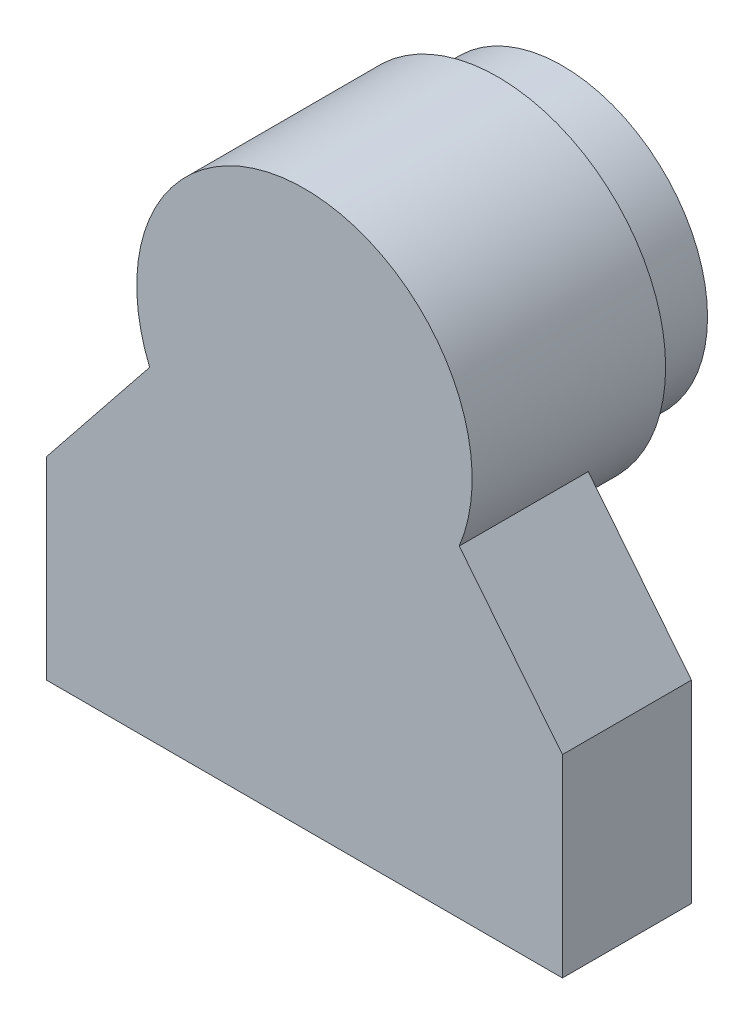
ISO-10303-21;
HEADER;
FILE_DESCRIPTION(('STEP AP214'),'2;1');
FILE_NAME('part.step','',(''),(''),'','','');
FILE_SCHEMA(('AUTOMOTIVE_DESIGN { 1 0 10303 214 1 1 1 1 }'));
ENDSEC;
DATA;
#1=APPLICATION_CONTEXT('core data for automotive mechanical design processes');
#2=APPLICATION_PROTOCOL_DEFINITION('international standard','automotive_design',2000,#1);
#3=PRODUCT_CONTEXT('',#1,'mechanical');
#4=PRODUCT('Part','Part','',(#3));
#5=PRODUCT_RELATED_PRODUCT_CATEGORY('part','',(#4));
#6=PRODUCT_DEFINITION_FORMATION('','',#4);
#7=PRODUCT_DEFINITION_CONTEXT('part definition',#1,'design');
#8=PRODUCT_DEFINITION('design','',#6,#7);
#9=PRODUCT_DEFINITION_SHAPE('','',#8);
#10=(LENGTH_UNIT() NAMED_UNIT(*) SI_UNIT(.MILLI.,.METRE.));
#11=(NAMED_UNIT(*) PLANE_ANGLE_UNIT() SI_UNIT($,.RADIAN.));
#12=(NAMED_UNIT(*) SI_UNIT($,.STERADIAN.) SOLID_ANGLE_UNIT());
#13=UNCERTAINTY_MEASURE_WITH_UNIT(LENGTH_MEASURE(1.E-05),#10,'distance_accuracy_value','');
#14=(GEOMETRIC_REPRESENTATION_CONTEXT(3) GLOBAL_UNCERTAINTY_ASSIGNED_CONTEXT((#13)) GLOBAL_UNIT_ASSIGNED_CONTEXT((#10,
#11,#12)) REPRESENTATION_CONTEXT('',''));
#15=CARTESIAN_POINT('',(0.,0.,0.));
#16=DIRECTION('',(0.,0.,1.));
#17=DIRECTION('',(1.,0.,0.));
#18=AXIS2_PLACEMENT_3D('',#15,#16,#17);
#19=CARTESIAN_POINT('',(0.,0.,-10.));
#20=DIRECTION('',(0.,0.,1.));
#21=DIRECTION('',(1.,0.,0.));
#22=AXIS2_PLACEMENT_3D('',#19,#20,#21);
#23=CYLINDRICAL_SURFACE('',#22,22.5);
#24=CARTESIAN_POINT('',(0.,0.,-10.));
#25=DIRECTION('',(0.,0.,1.));
#26=DIRECTION('',(1.,0.,0.));
#27=AXIS2_PLACEMENT_3D('',#24,#25,#26);
#28=CIRCLE('',#27,22.5);
#29=CARTESIAN_POINT('',(22.5,0.,-10.));
#30=VERTEX_POINT('',#29);
#31=EDGE_CURVE('E11',#30,#30,#28,.T.);
#32=ORIENTED_EDGE('',*,*,#31,.T.);
#33=EDGE_LOOP('',(#32));
#34=FACE_BOUND('',#33,.T.);
#35=CARTESIAN_POINT('',(0.,0.,0.));
#36=DIRECTION('',(0.,0.,1.));
#37=DIRECTION('',(1.,0.,0.));
#38=AXIS2_PLACEMENT_3D('',#35,#36,#37);
#39=CIRCLE('',#38,22.5);
#40=CARTESIAN_POINT('',(22.5,0.,0.));
#41=VERTEX_POINT('',#40);
#42=EDGE_CURVE('E42',#41,#41,#39,.T.);
#43=ORIENTED_EDGE('',*,*,#42,.F.);
#44=EDGE_LOOP('',(#43));
#45=FACE_BOUND('',#44,.T.);
#46=ADVANCED_FACE('F39',(#34,#45),#23,.T.);
#47=CARTESIAN_POINT('',(0.,0.,-10.));
#48=DIRECTION('',(0.,0.,1.));
#49=DIRECTION('',(1.,0.,0.));
#50=AXIS2_PLACEMENT_3D('',#47,#48,#49);
#51=PLANE('',#50);
#52=ORIENTED_EDGE('',*,*,#31,.F.);
#53=EDGE_LOOP('',(#52));
#54=FACE_BOUND('',#53,.T.);
#55=ADVANCED_FACE('F170',(#54),#51,.F.);
#56=CARTESIAN_POINT('',(0.,0.,30.));
#57=DIRECTION('',(0.,0.,-1.));
#58=DIRECTION('',(-1.,0.,0.));
#59=AXIS2_PLACEMENT_3D('',#56,#57,#58);
#60=CYLINDRICAL_SURFACE('',#59,26.);
#61=CARTESIAN_POINT('',(0.,0.,30.));
#62=DIRECTION('',(0.,0.,1.));
#63=DIRECTION('',(1.,0.,0.));
#64=AXIS2_PLACEMENT_3D('',#61,#62,#63);
#65=CIRCLE('',#64,26.);
#66=CARTESIAN_POINT('',(24.,-9.99999999999999,30.));
#67=VERTEX_POINT('',#66);
#68=CARTESIAN_POINT('',(-24.,-10.,30.));
#69=VERTEX_POINT('',#68);
#70=EDGE_CURVE('E145',#67,#69,#65,.T.);
#71=ORIENTED_EDGE('',*,*,#70,.F.);
#72=DIRECTION('',(0.,0.,1.));
#73=VECTOR('',#72,1.);
#74=CARTESIAN_POINT('',(24.,-9.99999999999999,10.));
#75=LINE('',#74,#73);
#76=CARTESIAN_POINT('',(24.,-9.99999999999999,10.));
#77=VERTEX_POINT('',#76);
#78=EDGE_CURVE('E137',#77,#67,#75,.T.);
#79=ORIENTED_EDGE('',*,*,#78,.F.);
#80=CARTESIAN_POINT('',(0.,0.,10.));
#81=DIRECTION('',(0.,0.,-1.));
#82=DIRECTION('',(1.,0.,0.));
#83=AXIS2_PLACEMENT_3D('',#80,#81,#82);
#84=CIRCLE('',#83,26.);
#85=CARTESIAN_POINT('',(-24.,-10.,10.));
#86=VERTEX_POINT('',#85);
#87=EDGE_CURVE('E62',#77,#86,#84,.T.);
#88=ORIENTED_EDGE('',*,*,#87,.T.);
#89=DIRECTION('',(0.,0.,1.));
#90=VECTOR('',#89,1.);
#91=CARTESIAN_POINT('',(-24.,-10.,10.));
#92=LINE('',#91,#90);
#93=EDGE_CURVE('E93',#86,#69,#92,.T.);
#94=ORIENTED_EDGE('',*,*,#93,.T.);
#95=EDGE_LOOP('',(#71,#79,#88,#94));
#96=FACE_BOUND('',#95,.T.);
#97=CARTESIAN_POINT('',(0.,0.,0.));
#98=DIRECTION('',(0.,0.,1.));
#99=DIRECTION('',(1.,0.,0.));
#100=AXIS2_PLACEMENT_3D('',#97,#98,#99);
#101=CIRCLE('',#100,26.);
#102=CARTESIAN_POINT('',(26.,0.,0.));
#103=VERTEX_POINT('',#102);
#104=EDGE_CURVE('E139',#103,#103,#101,.T.);
#105=ORIENTED_EDGE('',*,*,#104,.T.);
#106=EDGE_LOOP('',(#105));
#107=FACE_BOUND('',#106,.T.);
#108=ADVANCED_FACE('F150',(#96,#107),#60,.T.);
#109=CARTESIAN_POINT('',(0.,0.,30.));
#110=DIRECTION('',(0.,0.,1.));
#111=DIRECTION('',(1.,0.,0.));
#112=AXIS2_PLACEMENT_3D('',#109,#110,#111);
#113=PLANE('',#112);
#114=ORIENTED_EDGE('',*,*,#70,.T.);
#115=DIRECTION('',(-0.624695047554424,-0.78086880944303,0.));
#116=VECTOR('',#115,1.);
#117=CARTESIAN_POINT('',(-24.,-10.,30.));
#118=LINE('',#117,#116);
#119=CARTESIAN_POINT('',(-40.,-30.,30.));
#120=VERTEX_POINT('',#119);
#121=EDGE_CURVE('E126',#69,#120,#118,.T.);
#122=ORIENTED_EDGE('',*,*,#121,.T.);
#123=DIRECTION('',(0.,-1.,0.));
#124=VECTOR('',#123,1.);
#125=CARTESIAN_POINT('',(-40.,-30.,30.));
#126=LINE('',#125,#124);
#127=CARTESIAN_POINT('',(-40.,-60.,30.));
#128=VERTEX_POINT('',#127);
#129=EDGE_CURVE('E129',#120,#128,#126,.T.);
#130=ORIENTED_EDGE('',*,*,#129,.T.);
#131=DIRECTION('',(1.,0.,0.));
#132=VECTOR('',#131,1.);
#133=CARTESIAN_POINT('',(-40.,-60.,30.));
#134=LINE('',#133,#132);
#135=CARTESIAN_POINT('',(40.,-60.,30.));
#136=VERTEX_POINT('',#135);
#137=EDGE_CURVE('E133',#128,#136,#134,.T.);
#138=ORIENTED_EDGE('',*,*,#137,.T.);
#139=DIRECTION('',(0.,1.,0.));
#140=VECTOR('',#139,1.);
#141=CARTESIAN_POINT('',(40.,-60.,30.));
#142=LINE('',#141,#140);
#143=CARTESIAN_POINT('',(40.,-30.,30.));
#144=VERTEX_POINT('',#143);
#145=EDGE_CURVE('E104',#136,#144,#142,.T.);
#146=ORIENTED_EDGE('',*,*,#145,.T.);
#147=DIRECTION('',(-0.624695047554424,0.78086880944303,0.));
#148=VECTOR('',#147,1.);
#149=CARTESIAN_POINT('',(40.,-30.,30.));
#150=LINE('',#149,#148);
#151=EDGE_CURVE('E53',#144,#67,#150,.T.);
#152=ORIENTED_EDGE('',*,*,#151,.T.);
#153=EDGE_LOOP('',(#114,#122,#130,#138,#146,#152));
#154=FACE_BOUND('',#153,.T.);
#155=ADVANCED_FACE('F155',(#154),#113,.T.);
#156=CARTESIAN_POINT('',(0.,0.,0.));
#157=DIRECTION('',(0.,0.,1.));
#158=DIRECTION('',(1.,0.,0.));
#159=AXIS2_PLACEMENT_3D('',#156,#157,#158);
#160=PLANE('',#159);
#161=ORIENTED_EDGE('',*,*,#42,.T.);
#162=EDGE_LOOP('',(#161));
#163=FACE_BOUND('',#162,.T.);
#164=ORIENTED_EDGE('',*,*,#104,.F.);
#165=EDGE_LOOP('',(#164));
#166=FACE_BOUND('',#165,.T.);
#167=ADVANCED_FACE('F152',(#163,#166),#160,.F.);
#168=CARTESIAN_POINT('',(40.,-30.,10.));
#169=DIRECTION('',(0.78086880944303,0.624695047554424,0.));
#170=DIRECTION('',(-0.624695047554424,0.78086880944303,0.));
#171=AXIS2_PLACEMENT_3D('',#168,#169,#170);
#172=PLANE('',#171);
#173=ORIENTED_EDGE('',*,*,#151,.F.);
#174=DIRECTION('',(0.,0.,1.));
#175=VECTOR('',#174,1.);
#176=CARTESIAN_POINT('',(40.,-30.,10.));
#177=LINE('',#176,#175);
#178=CARTESIAN_POINT('',(40.,-30.,10.));
#179=VERTEX_POINT('',#178);
#180=EDGE_CURVE('E86',#179,#144,#177,.T.);
#181=ORIENTED_EDGE('',*,*,#180,.F.);
#182=DIRECTION('',(-0.624695047554424,0.78086880944303,0.));
#183=VECTOR('',#182,1.);
#184=CARTESIAN_POINT('',(40.,-30.,10.));
#185=LINE('',#184,#183);
#186=EDGE_CURVE('E116',#179,#77,#185,.T.);
#187=ORIENTED_EDGE('',*,*,#186,.T.);
#188=ORIENTED_EDGE('',*,*,#78,.T.);
#189=EDGE_LOOP('',(#173,#181,#187,#188));
#190=FACE_BOUND('',#189,.T.);
#191=ADVANCED_FACE('F154',(#190),#172,.T.);
#192=CARTESIAN_POINT('',(40.,-60.,10.));
#193=DIRECTION('',(1.,0.,0.));
#194=DIRECTION('',(0.,0.,-1.));
#195=AXIS2_PLACEMENT_3D('',#192,#193,#194);
#196=PLANE('',#195);
#197=ORIENTED_EDGE('',*,*,#145,.F.);
#198=DIRECTION('',(0.,0.,1.));
#199=VECTOR('',#198,1.);
#200=CARTESIAN_POINT('',(40.,-60.,10.));
#201=LINE('',#200,#199);
#202=CARTESIAN_POINT('',(40.,-60.,10.));
#203=VERTEX_POINT('',#202);
#204=EDGE_CURVE('E100',#203,#136,#201,.T.);
#205=ORIENTED_EDGE('',*,*,#204,.F.);
#206=DIRECTION('',(0.,1.,0.));
#207=VECTOR('',#206,1.);
#208=CARTESIAN_POINT('',(40.,-60.,10.));
#209=LINE('',#208,#207);
#210=EDGE_CURVE('E103',#203,#179,#209,.T.);
#211=ORIENTED_EDGE('',*,*,#210,.T.);
#212=ORIENTED_EDGE('',*,*,#180,.T.);
#213=EDGE_LOOP('',(#197,#205,#211,#212));
#214=FACE_BOUND('',#213,.T.);
#215=ADVANCED_FACE('F102',(#214),#196,.T.);
#216=CARTESIAN_POINT('',(-40.,-60.,10.));
#217=DIRECTION('',(0.,-1.,0.));
#218=DIRECTION('',(1.,0.,0.));
#219=AXIS2_PLACEMENT_3D('',#216,#217,#218);
#220=PLANE('',#219);
#221=CARTESIAN_POINT('',(-30.,-60.,20.));
#222=DIRECTION('',(0.,-1.,0.));
#223=DIRECTION('',(1.,0.,0.));
#224=AXIS2_PLACEMENT_3D('',#221,#222,#223);
#225=CIRCLE('',#224,2.5);
#226=CARTESIAN_POINT('',(-27.5,-60.,20.));
#227=VERTEX_POINT('',#226);
#228=EDGE_CURVE('E203',#227,#227,#225,.T.);
#229=ORIENTED_EDGE('',*,*,#228,.F.);
#230=EDGE_LOOP('',(#229));
#231=FACE_BOUND('',#230,.T.);
#232=CARTESIAN_POINT('',(30.,-60.,20.));
#233=DIRECTION('',(0.,-1.,0.));
#234=DIRECTION('',(1.,0.,0.));
#235=AXIS2_PLACEMENT_3D('',#232,#233,#234);
#236=CIRCLE('',#235,2.5);
#237=CARTESIAN_POINT('',(32.5,-60.,20.));
#238=VERTEX_POINT('',#237);
#239=EDGE_CURVE('E200',#238,#238,#236,.T.);
#240=ORIENTED_EDGE('',*,*,#239,.F.);
#241=EDGE_LOOP('',(#240));
#242=FACE_BOUND('',#241,.T.);
#243=CARTESIAN_POINT('',(0.,-60.,20.));
#244=DIRECTION('',(0.,-1.,0.));
#245=DIRECTION('',(1.,0.,0.));
#246=AXIS2_PLACEMENT_3D('',#243,#244,#245);
#247=CIRCLE('',#246,2.5);
#248=CARTESIAN_POINT('',(2.50000000000001,-60.,20.));
#249=VERTEX_POINT('',#248);
#250=EDGE_CURVE('E194',#249,#249,#247,.T.);
#251=ORIENTED_EDGE('',*,*,#250,.F.);
#252=EDGE_LOOP('',(#251));
#253=FACE_BOUND('',#252,.T.);
#254=ORIENTED_EDGE('',*,*,#137,.F.);
#255=DIRECTION('',(0.,0.,1.));
#256=VECTOR('',#255,1.);
#257=CARTESIAN_POINT('',(-40.,-60.,10.));
#258=LINE('',#257,#256);
#259=CARTESIAN_POINT('',(-40.,-60.,10.));
#260=VERTEX_POINT('',#259);
#261=EDGE_CURVE('E109',#260,#128,#258,.T.);
#262=ORIENTED_EDGE('',*,*,#261,.F.);
#263=DIRECTION('',(1.,0.,0.));
#264=VECTOR('',#263,1.);
#265=CARTESIAN_POINT('',(-40.,-60.,10.));
#266=LINE('',#265,#264);
#267=EDGE_CURVE('E114',#260,#203,#266,.T.);
#268=ORIENTED_EDGE('',*,*,#267,.T.);
#269=ORIENTED_EDGE('',*,*,#204,.T.);
#270=EDGE_LOOP('',(#254,#262,#268,#269));
#271=FACE_BOUND('',#270,.T.);
#272=ADVANCED_FACE('F118',(#231,#242,#253,#271),#220,.T.);
#273=CARTESIAN_POINT('',(-40.,-30.,10.));
#274=DIRECTION('',(-1.,0.,0.));
#275=DIRECTION('',(0.,0.,1.));
#276=AXIS2_PLACEMENT_3D('',#273,#274,#275);
#277=PLANE('',#276);
#278=ORIENTED_EDGE('',*,*,#129,.F.);
#279=DIRECTION('',(0.,0.,1.));
#280=VECTOR('',#279,1.);
#281=CARTESIAN_POINT('',(-40.,-30.,10.));
#282=LINE('',#281,#280);
#283=CARTESIAN_POINT('',(-40.,-30.,10.));
#284=VERTEX_POINT('',#283);
#285=EDGE_CURVE('E142',#284,#120,#282,.T.);
#286=ORIENTED_EDGE('',*,*,#285,.F.);
#287=DIRECTION('',(0.,-1.,0.));
#288=VECTOR('',#287,1.);
#289=CARTESIAN_POINT('',(-40.,-30.,10.));
#290=LINE('',#289,#288);
#291=EDGE_CURVE('E119',#284,#260,#290,.T.);
#292=ORIENTED_EDGE('',*,*,#291,.T.);
#293=ORIENTED_EDGE('',*,*,#261,.T.);
#294=EDGE_LOOP('',(#278,#286,#292,#293));
#295=FACE_BOUND('',#294,.T.);
#296=ADVANCED_FACE('F188',(#295),#277,.T.);
#297=CARTESIAN_POINT('',(-24.,-10.,10.));
#298=DIRECTION('',(-0.780868809443031,0.624695047554424,0.));
#299=DIRECTION('',(-0.624695047554424,-0.780868809443031,0.));
#300=AXIS2_PLACEMENT_3D('',#297,#298,#299);
#301=PLANE('',#300);
#302=ORIENTED_EDGE('',*,*,#121,.F.);
#303=ORIENTED_EDGE('',*,*,#93,.F.);
#304=DIRECTION('',(-0.624695047554424,-0.78086880944303,0.));
#305=VECTOR('',#304,1.);
#306=CARTESIAN_POINT('',(-24.,-10.,10.));
#307=LINE('',#306,#305);
#308=EDGE_CURVE('E121',#86,#284,#307,.T.);
#309=ORIENTED_EDGE('',*,*,#308,.T.);
#310=ORIENTED_EDGE('',*,*,#285,.T.);
#311=EDGE_LOOP('',(#302,#303,#309,#310));
#312=FACE_BOUND('',#311,.T.);
#313=ADVANCED_FACE('F186',(#312),#301,.T.);
#314=CARTESIAN_POINT('',(0.,0.,10.));
#315=DIRECTION('',(0.,0.,1.));
#316=DIRECTION('',(1.,0.,0.));
#317=AXIS2_PLACEMENT_3D('',#314,#315,#316);
#318=PLANE('',#317);
#319=ORIENTED_EDGE('',*,*,#87,.F.);
#320=ORIENTED_EDGE('',*,*,#186,.F.);
#321=ORIENTED_EDGE('',*,*,#210,.F.);
#322=ORIENTED_EDGE('',*,*,#267,.F.);
#323=ORIENTED_EDGE('',*,*,#291,.F.);
#324=ORIENTED_EDGE('',*,*,#308,.F.);
#325=EDGE_LOOP('',(#319,#320,#321,#322,#323,#324));
#326=FACE_BOUND('',#325,.T.);
#327=ADVANCED_FACE('F112',(#326),#318,.F.);
#328=CARTESIAN_POINT('',(0.,-50.,20.));
#329=DIRECTION('',(0.,-1.,0.));
#330=DIRECTION('',(1.,0.,0.));
#331=AXIS2_PLACEMENT_3D('',#328,#329,#330);
#332=CYLINDRICAL_SURFACE('',#331,2.5);
#333=CARTESIAN_POINT('',(0.,-50.,20.));
#334=DIRECTION('',(0.,-1.,0.));
#335=DIRECTION('',(1.,0.,0.));
#336=AXIS2_PLACEMENT_3D('',#333,#334,#335);
#337=CIRCLE('',#336,2.5);
#338=CARTESIAN_POINT('',(2.5,-50.,20.));
#339=VERTEX_POINT('',#338);
#340=EDGE_CURVE('E191',#339,#339,#337,.T.);
#341=ORIENTED_EDGE('',*,*,#340,.F.);
#342=EDGE_LOOP('',(#341));
#343=FACE_BOUND('',#342,.T.);
#344=ORIENTED_EDGE('',*,*,#250,.T.);
#345=EDGE_LOOP('',(#344));
#346=FACE_BOUND('',#345,.T.);
#347=ADVANCED_FACE('F225',(#343,#346),#332,.F.);
#348=CARTESIAN_POINT('',(0.,-50.,20.));
#349=DIRECTION('',(0.,-1.,0.));
#350=DIRECTION('',(1.,0.,0.));
#351=AXIS2_PLACEMENT_3D('',#348,#349,#350);
#352=PLANE('',#351);
#353=ORIENTED_EDGE('',*,*,#340,.T.);
#354=EDGE_LOOP('',(#353));
#355=FACE_BOUND('',#354,.T.);
#356=ADVANCED_FACE('F227',(#355),#352,.T.);
#357=CARTESIAN_POINT('',(30.,-50.,20.));
#358=DIRECTION('',(0.,-1.,0.));
#359=DIRECTION('',(1.,0.,0.));
#360=AXIS2_PLACEMENT_3D('',#357,#358,#359);
#361=CYLINDRICAL_SURFACE('',#360,2.5);
#362=CARTESIAN_POINT('',(30.,-50.,20.));
#363=DIRECTION('',(0.,-1.,0.));
#364=DIRECTION('',(1.,0.,0.));
#365=AXIS2_PLACEMENT_3D('',#362,#363,#364);
#366=CIRCLE('',#365,2.5);
#367=CARTESIAN_POINT('',(32.5,-50.,20.));
#368=VERTEX_POINT('',#367);
#369=EDGE_CURVE('E197',#368,#368,#366,.T.);
#370=ORIENTED_EDGE('',*,*,#369,.F.);
#371=EDGE_LOOP('',(#370));
#372=FACE_BOUND('',#371,.T.);
#373=ORIENTED_EDGE('',*,*,#239,.T.);
#374=EDGE_LOOP('',(#373));
#375=FACE_BOUND('',#374,.T.);
#376=ADVANCED_FACE('F233',(#372,#375),#361,.F.);
#377=CARTESIAN_POINT('',(30.,-50.,20.));
#378=DIRECTION('',(0.,-1.,0.));
#379=DIRECTION('',(1.,0.,0.));
#380=AXIS2_PLACEMENT_3D('',#377,#378,#379);
#381=PLANE('',#380);
#382=ORIENTED_EDGE('',*,*,#369,.T.);
#383=EDGE_LOOP('',(#382));
#384=FACE_BOUND('',#383,.T.);
#385=ADVANCED_FACE('F214',(#384),#381,.T.);
#386=CARTESIAN_POINT('',(-30.,-50.,20.));
#387=DIRECTION('',(0.,-1.,0.));
#388=DIRECTION('',(1.,0.,0.));
#389=AXIS2_PLACEMENT_3D('',#386,#387,#388);
#390=CYLINDRICAL_SURFACE('',#389,2.5);
#391=CARTESIAN_POINT('',(-30.,-50.,20.));
#392=DIRECTION('',(0.,-1.,0.));
#393=DIRECTION('',(1.,0.,0.));
#394=AXIS2_PLACEMENT_3D('',#391,#392,#393);
#395=CIRCLE('',#394,2.5);
#396=CARTESIAN_POINT('',(-27.5,-50.,20.));
#397=VERTEX_POINT('',#396);
#398=EDGE_CURVE('E130',#397,#397,#395,.T.);
#399=ORIENTED_EDGE('',*,*,#398,.F.);
#400=EDGE_LOOP('',(#399));
#401=FACE_BOUND('',#400,.T.);
#402=ORIENTED_EDGE('',*,*,#228,.T.);
#403=EDGE_LOOP('',(#402));
#404=FACE_BOUND('',#403,.T.);
#405=ADVANCED_FACE('F211',(#401,#404),#390,.F.);
#406=CARTESIAN_POINT('',(-30.,-50.,20.));
#407=DIRECTION('',(0.,-1.,0.));
#408=DIRECTION('',(1.,0.,0.));
#409=AXIS2_PLACEMENT_3D('',#406,#407,#408);
#410=PLANE('',#409);
#411=ORIENTED_EDGE('',*,*,#398,.T.);
#412=EDGE_LOOP('',(#411));
#413=FACE_BOUND('',#412,.T.);
#414=ADVANCED_FACE('F209',(#413),#410,.T.);
#415=CLOSED_SHELL('',(#46,#55,#108,#155,#167,#191,#215,#272,#296,#313,#327,#347,#356,#376,#385,
#405,#414));
#416=MANIFOLD_SOLID_BREP('B2',#415);
#417=ADVANCED_BREP_SHAPE_REPRESENTATION('',(#18,#416),#14);
#418=SHAPE_DEFINITION_REPRESENTATION(#9,#417);
ENDSEC;
END-ISO-10303-21;
